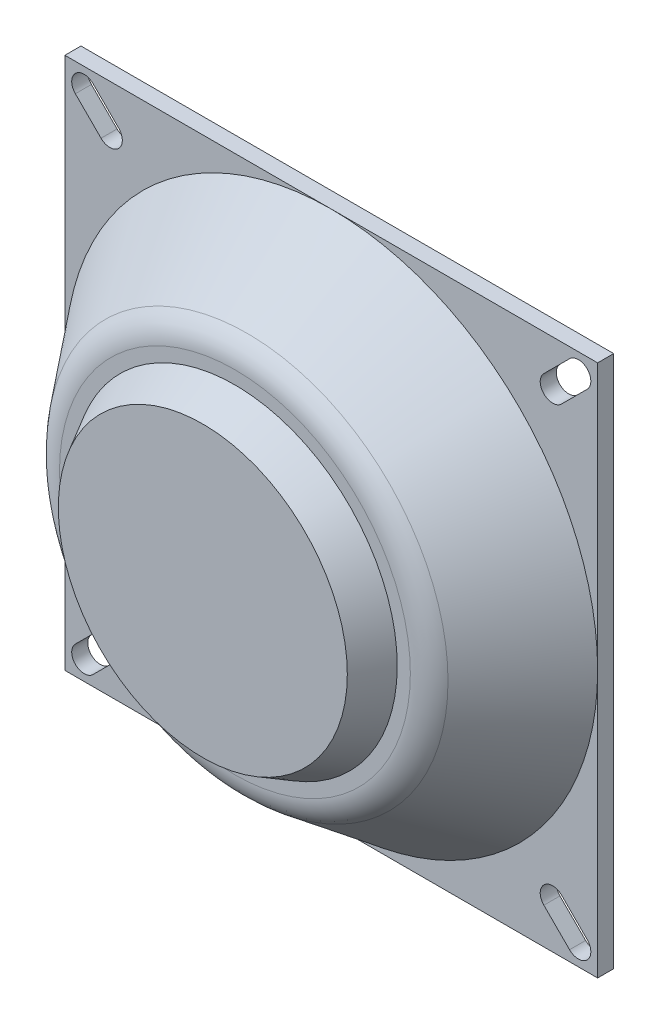
ISO-10303-21;
HEADER;
FILE_DESCRIPTION(('STEP AP214'),'2;1');
FILE_NAME('part.step','',(''),(''),'','','');
FILE_SCHEMA(('AUTOMOTIVE_DESIGN { 1 0 10303 214 1 1 1 1 }'));
ENDSEC;
DATA;
#1=APPLICATION_CONTEXT('core data for automotive mechanical design processes');
#2=APPLICATION_PROTOCOL_DEFINITION('international standard','automotive_design',2000,#1);
#3=PRODUCT_CONTEXT('',#1,'mechanical');
#4=PRODUCT('Part','Part','',(#3));
#5=PRODUCT_RELATED_PRODUCT_CATEGORY('part','',(#4));
#6=PRODUCT_DEFINITION_FORMATION('','',#4);
#7=PRODUCT_DEFINITION_CONTEXT('part definition',#1,'design');
#8=PRODUCT_DEFINITION('design','',#6,#7);
#9=PRODUCT_DEFINITION_SHAPE('','',#8);
#10=(LENGTH_UNIT() NAMED_UNIT(*) SI_UNIT(.MILLI.,.METRE.));
#11=(NAMED_UNIT(*) PLANE_ANGLE_UNIT() SI_UNIT($,.RADIAN.));
#12=(NAMED_UNIT(*) SI_UNIT($,.STERADIAN.) SOLID_ANGLE_UNIT());
#13=UNCERTAINTY_MEASURE_WITH_UNIT(LENGTH_MEASURE(1.E-05),#10,'distance_accuracy_value','');
#14=(GEOMETRIC_REPRESENTATION_CONTEXT(3) GLOBAL_UNCERTAINTY_ASSIGNED_CONTEXT((#13)) GLOBAL_UNIT_ASSIGNED_CONTEXT((#10,
#11,#12)) REPRESENTATION_CONTEXT('',''));
#15=CARTESIAN_POINT('',(0.,0.,0.));
#16=DIRECTION('',(0.,0.,1.));
#17=DIRECTION('',(1.,0.,0.));
#18=AXIS2_PLACEMENT_3D('',#15,#16,#17);
#19=CARTESIAN_POINT('',(-305.359774758607,116.794851209174,0.));
#20=DIRECTION('',(0.,0.,-1.));
#21=DIRECTION('',(1.,0.,0.));
#22=AXIS2_PLACEMENT_3D('',#19,#20,#21);
#23=CONICAL_SURFACE('',#22,45.,0.506145483078356);
#24=CARTESIAN_POINT('',(-305.359774758607,116.794851209174,-10.));
#25=DIRECTION('',(0.,0.,1.));
#26=DIRECTION('',(1.,0.,0.));
#27=AXIS2_PLACEMENT_3D('',#24,#25,#26);
#28=CIRCLE('',#27,50.5430905145277);
#29=CARTESIAN_POINT('',(-254.816684244079,116.794851209174,-10.));
#30=VERTEX_POINT('',#29);
#31=EDGE_CURVE('E441',#30,#30,#28,.F.);
#32=ORIENTED_EDGE('',*,*,#31,.F.);
#33=EDGE_LOOP('',(#32));
#34=FACE_BOUND('',#33,.T.);
#35=CARTESIAN_POINT('',(-305.359774758607,116.794851209174,0.));
#36=DIRECTION('',(0.,0.,1.));
#37=DIRECTION('',(1.,0.,0.));
#38=AXIS2_PLACEMENT_3D('',#35,#36,#37);
#39=CIRCLE('',#38,45.);
#40=CARTESIAN_POINT('',(-260.359774758607,116.794851209174,0.));
#41=VERTEX_POINT('',#40);
#42=EDGE_CURVE('E436',#41,#41,#39,.T.);
#43=ORIENTED_EDGE('',*,*,#42,.F.);
#44=EDGE_LOOP('',(#43));
#45=FACE_BOUND('',#44,.T.);
#46=ADVANCED_FACE('F45',(#34,#45),#23,.T.);
#47=CARTESIAN_POINT('',(0.,0.,0.));
#48=DIRECTION('',(0.,0.,1.));
#49=DIRECTION('',(1.,0.,0.));
#50=AXIS2_PLACEMENT_3D('',#47,#48,#49);
#51=PLANE('',#50);
#52=ORIENTED_EDGE('',*,*,#42,.T.);
#53=EDGE_LOOP('',(#52));
#54=FACE_BOUND('',#53,.T.);
#55=ADVANCED_FACE('F467',(#54),#51,.T.);
#56=CARTESIAN_POINT('',(-305.359774758607,116.794851209174,-10.));
#57=DIRECTION('',(0.,0.,-1.));
#58=DIRECTION('',(1.,0.,0.));
#59=AXIS2_PLACEMENT_3D('',#56,#57,#58);
#60=CONICAL_SURFACE('',#59,59.508676160867,0.663225115757846);
#61=CARTESIAN_POINT('',(-305.359774758607,116.794851209174,-13.8433852467434));
#62=DIRECTION('',(0.,0.,1.));
#63=DIRECTION('',(1.,0.,0.));
#64=AXIS2_PLACEMENT_3D('',#61,#62,#63);
#65=CIRCLE('',#64,62.5114578112756);
#66=CARTESIAN_POINT('',(-242.848316947331,116.794851209174,-13.8433852467434));
#67=VERTEX_POINT('',#66);
#68=EDGE_CURVE('E11',#67,#67,#65,.F.);
#69=ORIENTED_EDGE('',*,*,#68,.T.);
#70=EDGE_LOOP('',(#69));
#71=FACE_BOUND('',#70,.T.);
#72=CARTESIAN_POINT('',(-305.359774758607,116.794851209174,-40.));
#73=DIRECTION('',(0.,0.,1.));
#74=DIRECTION('',(1.,0.,0.));
#75=AXIS2_PLACEMENT_3D('',#72,#73,#74);
#76=CIRCLE('',#75,82.9472449560686);
#77=CARTESIAN_POINT('',(-222.412529802538,116.794851209174,-40.));
#78=VERTEX_POINT('',#77);
#79=CARTESIAN_POINT('',(-305.359774758607,33.8476062531058,-40.));
#80=VERTEX_POINT('',#79);
#81=EDGE_CURVE('E432',#78,#80,#76,.F.);
#82=ORIENTED_EDGE('',*,*,#81,.F.);
#83=CARTESIAN_POINT('',(-305.359774758607,199.742096165243,-40.));
#84=VERTEX_POINT('',#83);
#85=EDGE_CURVE('E61',#84,#78,#76,.F.);
#86=ORIENTED_EDGE('',*,*,#85,.F.);
#87=CARTESIAN_POINT('',(-388.307019714675,116.794851209174,-40.));
#88=VERTEX_POINT('',#87);
#89=EDGE_CURVE('E65',#88,#84,#76,.F.);
#90=ORIENTED_EDGE('',*,*,#89,.F.);
#91=EDGE_CURVE('E437',#80,#88,#76,.F.);
#92=ORIENTED_EDGE('',*,*,#91,.F.);
#93=EDGE_LOOP('',(#82,#86,#90,#92));
#94=FACE_BOUND('',#93,.T.);
#95=ADVANCED_FACE('F463',(#71,#94),#60,.T.);
#96=CARTESIAN_POINT('',(-305.359774758607,116.794851209174,-10.));
#97=DIRECTION('',(0.,0.,1.));
#98=DIRECTION('',(1.,0.,0.));
#99=AXIS2_PLACEMENT_3D('',#96,#97,#98);
#100=PLANE('',#99);
#101=CARTESIAN_POINT('',(-305.359774758607,116.794851209174,-10.));
#102=DIRECTION('',(0.,0.,1.));
#103=DIRECTION('',(1.,0.,0.));
#104=AXIS2_PLACEMENT_3D('',#101,#102,#103);
#105=CIRCLE('',#104,54.6313502752084);
#106=CARTESIAN_POINT('',(-250.728424483398,116.794851209174,-10.));
#107=VERTEX_POINT('',#106);
#108=EDGE_CURVE('E54',#107,#107,#105,.T.);
#109=ORIENTED_EDGE('',*,*,#108,.T.);
#110=EDGE_LOOP('',(#109));
#111=FACE_BOUND('',#110,.T.);
#112=ORIENTED_EDGE('',*,*,#31,.T.);
#113=EDGE_LOOP('',(#112));
#114=FACE_BOUND('',#113,.T.);
#115=ADVANCED_FACE('F448',(#111,#114),#100,.T.);
#116=CARTESIAN_POINT('',(-305.359774758607,116.794851209174,-20.));
#117=DIRECTION('',(0.,0.,1.));
#118=DIRECTION('',(1.,0.,0.));
#119=AXIS2_PLACEMENT_3D('',#116,#117,#118);
#120=TOROIDAL_SURFACE('',#119,54.6313502752084,10.);
#121=ORIENTED_EDGE('',*,*,#68,.F.);
#122=EDGE_LOOP('',(#121));
#123=FACE_BOUND('',#122,.T.);
#124=ORIENTED_EDGE('',*,*,#108,.F.);
#125=EDGE_LOOP('',(#124));
#126=FACE_BOUND('',#125,.T.);
#127=ADVANCED_FACE('F47',(#123,#126),#120,.T.);
#128=CARTESIAN_POINT('',(0.,0.,-40.));
#129=DIRECTION('',(0.,0.,-1.));
#130=DIRECTION('',(-1.,0.,0.));
#131=AXIS2_PLACEMENT_3D('',#128,#129,#130);
#132=PLANE('',#131);
#133=DIRECTION('',(-0.707106781186547,0.707106781186547,0.));
#134=VECTOR('',#133,1.);
#135=CARTESIAN_POINT('',(-225.670814757752,42.5893212978924,-40.));
#136=LINE('',#135,#134);
#137=CARTESIAN_POINT('',(-225.670814757752,42.5893212978924,-40.));
#138=VERTEX_POINT('',#137);
#139=CARTESIAN_POINT('',(-233.670814757752,50.5893212978924,-40.));
#140=VERTEX_POINT('',#139);
#141=EDGE_CURVE('E234',#138,#140,#136,.T.);
#142=ORIENTED_EDGE('',*,*,#141,.F.);
#143=CARTESIAN_POINT('',(-228.412529802538,39.8476062531059,-40.));
#144=DIRECTION('',(0.,0.,1.));
#145=DIRECTION('',(-1.,0.,0.));
#146=AXIS2_PLACEMENT_3D('',#143,#144,#145);
#147=CIRCLE('',#146,3.87737060049937);
#148=CARTESIAN_POINT('',(-231.154244847325,37.1058912083194,-40.));
#149=VERTEX_POINT('',#148);
#150=EDGE_CURVE('E200',#149,#138,#147,.T.);
#151=ORIENTED_EDGE('',*,*,#150,.F.);
#152=DIRECTION('',(0.707106781186547,-0.707106781186547,0.));
#153=VECTOR('',#152,1.);
#154=CARTESIAN_POINT('',(-231.154244847325,37.1058912083194,-40.));
#155=LINE('',#154,#153);
#156=CARTESIAN_POINT('',(-239.154244847325,45.1058912083195,-40.));
#157=VERTEX_POINT('',#156);
#158=EDGE_CURVE('E221',#157,#149,#155,.T.);
#159=ORIENTED_EDGE('',*,*,#158,.F.);
#160=CARTESIAN_POINT('',(-236.412529802538,47.8476062531059,-40.));
#161=DIRECTION('',(0.,0.,1.));
#162=DIRECTION('',(-1.,0.,0.));
#163=AXIS2_PLACEMENT_3D('',#160,#161,#162);
#164=CIRCLE('',#163,3.87737060049937);
#165=EDGE_CURVE('E225',#140,#157,#164,.T.);
#166=ORIENTED_EDGE('',*,*,#165,.F.);
#167=EDGE_LOOP('',(#142,#151,#159,#166));
#168=FACE_BOUND('',#167,.T.);
#169=DIRECTION('',(0.,1.,0.));
#170=VECTOR('',#169,1.);
#171=CARTESIAN_POINT('',(-222.412529802538,199.742096165243,-40.));
#172=LINE('',#171,#170);
#173=CARTESIAN_POINT('',(-222.412529802538,33.8476062531059,-40.));
#174=VERTEX_POINT('',#173);
#175=EDGE_CURVE('E409',#174,#78,#172,.T.);
#176=ORIENTED_EDGE('',*,*,#175,.T.);
#177=ORIENTED_EDGE('',*,*,#81,.T.);
#178=DIRECTION('',(1.,0.,0.));
#179=VECTOR('',#178,1.);
#180=CARTESIAN_POINT('',(-222.412529802538,33.8476062531059,-40.));
#181=LINE('',#180,#179);
#182=EDGE_CURVE('E403',#80,#174,#181,.T.);
#183=ORIENTED_EDGE('',*,*,#182,.T.);
#184=EDGE_LOOP('',(#176,#177,#183));
#185=FACE_BOUND('',#184,.T.);
#186=ADVANCED_FACE('F452',(#168,#185),#132,.F.);
#187=DIRECTION('',(0.707106781186549,0.707106781186546,0.));
#188=VECTOR('',#187,1.);
#189=CARTESIAN_POINT('',(-379.565304669889,37.1058912083194,-40.));
#190=LINE('',#189,#188);
#191=CARTESIAN_POINT('',(-379.565304669889,37.1058912083195,-40.));
#192=VERTEX_POINT('',#191);
#193=CARTESIAN_POINT('',(-371.565304669889,45.1058912083194,-40.));
#194=VERTEX_POINT('',#193);
#195=EDGE_CURVE('E269',#192,#194,#190,.T.);
#196=ORIENTED_EDGE('',*,*,#195,.F.);
#197=CARTESIAN_POINT('',(-382.307019714675,39.8476062531059,-40.));
#198=DIRECTION('',(0.,0.,1.));
#199=DIRECTION('',(1.,0.,0.));
#200=AXIS2_PLACEMENT_3D('',#197,#198,#199);
#201=CIRCLE('',#200,3.87737060049939);
#202=CARTESIAN_POINT('',(-385.048734759462,42.5893212978924,-40.));
#203=VERTEX_POINT('',#202);
#204=EDGE_CURVE('E243',#203,#192,#201,.T.);
#205=ORIENTED_EDGE('',*,*,#204,.F.);
#206=DIRECTION('',(-0.707106781186551,-0.707106781186544,0.));
#207=VECTOR('',#206,1.);
#208=CARTESIAN_POINT('',(-385.048734759462,42.5893212978924,-40.));
#209=LINE('',#208,#207);
#210=CARTESIAN_POINT('',(-377.048734759462,50.5893212978923,-40.));
#211=VERTEX_POINT('',#210);
#212=EDGE_CURVE('E254',#211,#203,#209,.T.);
#213=ORIENTED_EDGE('',*,*,#212,.F.);
#214=CARTESIAN_POINT('',(-374.307019714675,47.8476062531059,-40.));
#215=DIRECTION('',(0.,0.,1.));
#216=DIRECTION('',(1.,0.,0.));
#217=AXIS2_PLACEMENT_3D('',#214,#215,#216);
#218=CIRCLE('',#217,3.87737060049937);
#219=EDGE_CURVE('E273',#194,#211,#218,.T.);
#220=ORIENTED_EDGE('',*,*,#219,.F.);
#221=EDGE_LOOP('',(#196,#205,#213,#220));
#222=FACE_BOUND('',#221,.T.);
#223=CARTESIAN_POINT('',(-388.307019714675,33.8476062531058,-40.));
#224=VERTEX_POINT('',#223);
#225=EDGE_CURVE('E404',#224,#80,#181,.T.);
#226=ORIENTED_EDGE('',*,*,#225,.T.);
#227=ORIENTED_EDGE('',*,*,#91,.T.);
#228=DIRECTION('',(0.,-1.,0.));
#229=VECTOR('',#228,1.);
#230=CARTESIAN_POINT('',(-388.307019714675,199.742096165243,-40.));
#231=LINE('',#230,#229);
#232=EDGE_CURVE('E371',#88,#224,#231,.T.);
#233=ORIENTED_EDGE('',*,*,#232,.T.);
#234=EDGE_LOOP('',(#226,#227,#233));
#235=FACE_BOUND('',#234,.T.);
#236=ADVANCED_FACE('F459',(#222,#235),#132,.F.);
#237=DIRECTION('',(0.707106781186551,-0.707106781186544,0.));
#238=VECTOR('',#237,1.);
#239=CARTESIAN_POINT('',(-385.048734759462,191.000381120456,-40.));
#240=LINE('',#239,#238);
#241=CARTESIAN_POINT('',(-385.048734759462,191.000381120456,-40.));
#242=VERTEX_POINT('',#241);
#243=CARTESIAN_POINT('',(-377.048734759462,183.000381120456,-40.));
#244=VERTEX_POINT('',#243);
#245=EDGE_CURVE('E313',#242,#244,#240,.T.);
#246=ORIENTED_EDGE('',*,*,#245,.F.);
#247=CARTESIAN_POINT('',(-382.307019714675,193.742096165243,-40.));
#248=DIRECTION('',(0.,0.,1.));
#249=DIRECTION('',(-1.,0.,0.));
#250=AXIS2_PLACEMENT_3D('',#247,#248,#249);
#251=CIRCLE('',#250,3.87737060049939);
#252=CARTESIAN_POINT('',(-379.565304669889,196.483811210029,-40.));
#253=VERTEX_POINT('',#252);
#254=EDGE_CURVE('E283',#253,#242,#251,.T.);
#255=ORIENTED_EDGE('',*,*,#254,.F.);
#256=DIRECTION('',(-0.707106781186549,0.707106781186546,0.));
#257=VECTOR('',#256,1.);
#258=CARTESIAN_POINT('',(-379.565304669889,196.483811210029,-40.));
#259=LINE('',#258,#257);
#260=CARTESIAN_POINT('',(-371.565304669889,188.483811210029,-40.));
#261=VERTEX_POINT('',#260);
#262=EDGE_CURVE('E298',#261,#253,#259,.T.);
#263=ORIENTED_EDGE('',*,*,#262,.F.);
#264=CARTESIAN_POINT('',(-374.307019714675,185.742096165243,-40.));
#265=DIRECTION('',(0.,0.,1.));
#266=DIRECTION('',(-1.,0.,0.));
#267=AXIS2_PLACEMENT_3D('',#264,#265,#266);
#268=CIRCLE('',#267,3.87737060049937);
#269=EDGE_CURVE('E317',#244,#261,#268,.T.);
#270=ORIENTED_EDGE('',*,*,#269,.F.);
#271=EDGE_LOOP('',(#246,#255,#263,#270));
#272=FACE_BOUND('',#271,.T.);
#273=CARTESIAN_POINT('',(-388.307019714675,199.742096165243,-40.));
#274=VERTEX_POINT('',#273);
#275=EDGE_CURVE('E399',#274,#88,#231,.T.);
#276=ORIENTED_EDGE('',*,*,#275,.T.);
#277=ORIENTED_EDGE('',*,*,#89,.T.);
#278=DIRECTION('',(-1.,0.,0.));
#279=VECTOR('',#278,1.);
#280=CARTESIAN_POINT('',(-222.412529802538,199.742096165243,-40.));
#281=LINE('',#280,#279);
#282=EDGE_CURVE('E413',#84,#274,#281,.T.);
#283=ORIENTED_EDGE('',*,*,#282,.T.);
#284=EDGE_LOOP('',(#276,#277,#283));
#285=FACE_BOUND('',#284,.T.);
#286=ADVANCED_FACE('F584',(#272,#285),#132,.F.);
#287=DIRECTION('',(-0.707106781186547,-0.707106781186547,0.));
#288=VECTOR('',#287,1.);
#289=CARTESIAN_POINT('',(-231.154244847325,196.483811210029,-40.));
#290=LINE('',#289,#288);
#291=CARTESIAN_POINT('',(-231.154244847325,196.483811210029,-40.));
#292=VERTEX_POINT('',#291);
#293=CARTESIAN_POINT('',(-239.154244847325,188.483811210029,-40.));
#294=VERTEX_POINT('',#293);
#295=EDGE_CURVE('E357',#292,#294,#290,.T.);
#296=ORIENTED_EDGE('',*,*,#295,.F.);
#297=CARTESIAN_POINT('',(-228.412529802538,193.742096165243,-40.));
#298=DIRECTION('',(0.,0.,1.));
#299=DIRECTION('',(1.,0.,0.));
#300=AXIS2_PLACEMENT_3D('',#297,#298,#299);
#301=CIRCLE('',#300,3.87737060049937);
#302=CARTESIAN_POINT('',(-225.670814757752,191.000381120456,-40.));
#303=VERTEX_POINT('',#302);
#304=EDGE_CURVE('E327',#303,#292,#301,.T.);
#305=ORIENTED_EDGE('',*,*,#304,.F.);
#306=DIRECTION('',(0.707106781186547,0.707106781186547,0.));
#307=VECTOR('',#306,1.);
#308=CARTESIAN_POINT('',(-225.670814757752,191.000381120456,-40.));
#309=LINE('',#308,#307);
#310=CARTESIAN_POINT('',(-233.670814757752,183.000381120456,-40.));
#311=VERTEX_POINT('',#310);
#312=EDGE_CURVE('E342',#311,#303,#309,.T.);
#313=ORIENTED_EDGE('',*,*,#312,.F.);
#314=CARTESIAN_POINT('',(-236.412529802538,185.742096165243,-40.));
#315=DIRECTION('',(0.,0.,1.));
#316=DIRECTION('',(1.,0.,0.));
#317=AXIS2_PLACEMENT_3D('',#314,#315,#316);
#318=CIRCLE('',#317,3.87737060049937);
#319=EDGE_CURVE('E361',#294,#311,#318,.T.);
#320=ORIENTED_EDGE('',*,*,#319,.F.);
#321=EDGE_LOOP('',(#296,#305,#313,#320));
#322=FACE_BOUND('',#321,.T.);
#323=CARTESIAN_POINT('',(-222.412529802538,199.742096165243,-40.));
#324=VERTEX_POINT('',#323);
#325=EDGE_CURVE('E386',#324,#84,#281,.T.);
#326=ORIENTED_EDGE('',*,*,#325,.T.);
#327=ORIENTED_EDGE('',*,*,#85,.T.);
#328=EDGE_CURVE('E408',#78,#324,#172,.T.);
#329=ORIENTED_EDGE('',*,*,#328,.T.);
#330=EDGE_LOOP('',(#326,#327,#329));
#331=FACE_BOUND('',#330,.T.);
#332=ADVANCED_FACE('F462',(#322,#331),#132,.F.);
#333=CARTESIAN_POINT('',(-388.307019714675,199.742096165243,-45.));
#334=DIRECTION('',(-1.,0.,0.));
#335=DIRECTION('',(0.,-1.,0.));
#336=AXIS2_PLACEMENT_3D('',#333,#334,#335);
#337=PLANE('',#336);
#338=ORIENTED_EDGE('',*,*,#275,.F.);
#339=DIRECTION('',(0.,0.,1.));
#340=VECTOR('',#339,1.);
#341=CARTESIAN_POINT('',(-388.307019714675,199.742096165243,-45.));
#342=LINE('',#341,#340);
#343=CARTESIAN_POINT('',(-388.307019714675,199.742096165243,-45.));
#344=VERTEX_POINT('',#343);
#345=EDGE_CURVE('E417',#344,#274,#342,.T.);
#346=ORIENTED_EDGE('',*,*,#345,.F.);
#347=DIRECTION('',(0.,-1.,0.));
#348=VECTOR('',#347,1.);
#349=CARTESIAN_POINT('',(-388.307019714675,199.742096165243,-45.));
#350=LINE('',#349,#348);
#351=CARTESIAN_POINT('',(-388.307019714675,33.8476062531058,-45.));
#352=VERTEX_POINT('',#351);
#353=EDGE_CURVE('E381',#344,#352,#350,.T.);
#354=ORIENTED_EDGE('',*,*,#353,.T.);
#355=DIRECTION('',(0.,0.,1.));
#356=VECTOR('',#355,1.);
#357=CARTESIAN_POINT('',(-388.307019714675,33.8476062531058,-45.));
#358=LINE('',#357,#356);
#359=EDGE_CURVE('E398',#352,#224,#358,.T.);
#360=ORIENTED_EDGE('',*,*,#359,.T.);
#361=ORIENTED_EDGE('',*,*,#232,.F.);
#362=EDGE_LOOP('',(#338,#346,#354,#360,#361));
#363=FACE_BOUND('',#362,.T.);
#364=ADVANCED_FACE('F479',(#363),#337,.T.);
#365=CARTESIAN_POINT('',(-222.412529802538,199.742096165243,-45.));
#366=DIRECTION('',(0.,1.,0.));
#367=DIRECTION('',(-1.,0.,0.));
#368=AXIS2_PLACEMENT_3D('',#365,#366,#367);
#369=PLANE('',#368);
#370=ORIENTED_EDGE('',*,*,#325,.F.);
#371=DIRECTION('',(0.,0.,1.));
#372=VECTOR('',#371,1.);
#373=CARTESIAN_POINT('',(-222.412529802538,199.742096165243,-45.));
#374=LINE('',#373,#372);
#375=CARTESIAN_POINT('',(-222.412529802538,199.742096165243,-45.));
#376=VERTEX_POINT('',#375);
#377=EDGE_CURVE('E421',#376,#324,#374,.T.);
#378=ORIENTED_EDGE('',*,*,#377,.F.);
#379=DIRECTION('',(-1.,0.,0.));
#380=VECTOR('',#379,1.);
#381=CARTESIAN_POINT('',(-222.412529802538,199.742096165243,-45.));
#382=LINE('',#381,#380);
#383=EDGE_CURVE('E394',#376,#344,#382,.T.);
#384=ORIENTED_EDGE('',*,*,#383,.T.);
#385=ORIENTED_EDGE('',*,*,#345,.T.);
#386=ORIENTED_EDGE('',*,*,#282,.F.);
#387=EDGE_LOOP('',(#370,#378,#384,#385,#386));
#388=FACE_BOUND('',#387,.T.);
#389=ADVANCED_FACE('F482',(#388),#369,.T.);
#390=CARTESIAN_POINT('',(-222.412529802538,199.742096165243,-45.));
#391=DIRECTION('',(1.,0.,0.));
#392=DIRECTION('',(0.,1.,0.));
#393=AXIS2_PLACEMENT_3D('',#390,#391,#392);
#394=PLANE('',#393);
#395=ORIENTED_EDGE('',*,*,#175,.F.);
#396=DIRECTION('',(0.,0.,1.));
#397=VECTOR('',#396,1.);
#398=CARTESIAN_POINT('',(-222.412529802538,33.8476062531059,-45.));
#399=LINE('',#398,#397);
#400=CARTESIAN_POINT('',(-222.412529802538,33.8476062531059,-45.));
#401=VERTEX_POINT('',#400);
#402=EDGE_CURVE('E425',#401,#174,#399,.T.);
#403=ORIENTED_EDGE('',*,*,#402,.F.);
#404=DIRECTION('',(0.,1.,0.));
#405=VECTOR('',#404,1.);
#406=CARTESIAN_POINT('',(-222.412529802538,199.742096165243,-45.));
#407=LINE('',#406,#405);
#408=EDGE_CURVE('E390',#401,#376,#407,.T.);
#409=ORIENTED_EDGE('',*,*,#408,.T.);
#410=ORIENTED_EDGE('',*,*,#377,.T.);
#411=ORIENTED_EDGE('',*,*,#328,.F.);
#412=EDGE_LOOP('',(#395,#403,#409,#410,#411));
#413=FACE_BOUND('',#412,.T.);
#414=ADVANCED_FACE('F487',(#413),#394,.T.);
#415=CARTESIAN_POINT('',(-222.412529802538,33.8476062531059,-45.));
#416=DIRECTION('',(0.,-1.,0.));
#417=DIRECTION('',(1.,0.,0.));
#418=AXIS2_PLACEMENT_3D('',#415,#416,#417);
#419=PLANE('',#418);
#420=ORIENTED_EDGE('',*,*,#225,.F.);
#421=ORIENTED_EDGE('',*,*,#359,.F.);
#422=DIRECTION('',(1.,0.,0.));
#423=VECTOR('',#422,1.);
#424=CARTESIAN_POINT('',(-222.412529802538,33.8476062531059,-45.));
#425=LINE('',#424,#423);
#426=EDGE_CURVE('E385',#352,#401,#425,.T.);
#427=ORIENTED_EDGE('',*,*,#426,.T.);
#428=ORIENTED_EDGE('',*,*,#402,.T.);
#429=ORIENTED_EDGE('',*,*,#182,.F.);
#430=EDGE_LOOP('',(#420,#421,#427,#428,#429));
#431=FACE_BOUND('',#430,.T.);
#432=ADVANCED_FACE('F484',(#431),#419,.T.);
#433=CARTESIAN_POINT('',(0.,0.,-45.));
#434=DIRECTION('',(0.,0.,-1.));
#435=DIRECTION('',(-1.,0.,0.));
#436=AXIS2_PLACEMENT_3D('',#433,#434,#435);
#437=PLANE('',#436);
#438=CARTESIAN_POINT('',(-228.412529802538,39.8476062531059,-45.));
#439=DIRECTION('',(0.,0.,1.));
#440=DIRECTION('',(-1.,0.,0.));
#441=AXIS2_PLACEMENT_3D('',#438,#439,#440);
#442=CIRCLE('',#441,3.87737060049937);
#443=CARTESIAN_POINT('',(-231.154244847325,37.1058912083194,-45.));
#444=VERTEX_POINT('',#443);
#445=CARTESIAN_POINT('',(-225.670814757752,42.5893212978924,-45.));
#446=VERTEX_POINT('',#445);
#447=EDGE_CURVE('E197',#444,#446,#442,.T.);
#448=ORIENTED_EDGE('',*,*,#447,.T.);
#449=DIRECTION('',(-0.707106781186547,0.707106781186547,0.));
#450=VECTOR('',#449,1.);
#451=CARTESIAN_POINT('',(-225.670814757752,42.5893212978924,-45.));
#452=LINE('',#451,#450);
#453=CARTESIAN_POINT('',(-233.670814757752,50.5893212978924,-45.));
#454=VERTEX_POINT('',#453);
#455=EDGE_CURVE('E210',#446,#454,#452,.T.);
#456=ORIENTED_EDGE('',*,*,#455,.T.);
#457=CARTESIAN_POINT('',(-236.412529802538,47.8476062531059,-45.));
#458=DIRECTION('',(0.,0.,1.));
#459=DIRECTION('',(-1.,0.,0.));
#460=AXIS2_PLACEMENT_3D('',#457,#458,#459);
#461=CIRCLE('',#460,3.87737060049937);
#462=CARTESIAN_POINT('',(-239.154244847325,45.1058912083195,-45.));
#463=VERTEX_POINT('',#462);
#464=EDGE_CURVE('E215',#454,#463,#461,.T.);
#465=ORIENTED_EDGE('',*,*,#464,.T.);
#466=DIRECTION('',(0.707106781186547,-0.707106781186547,0.));
#467=VECTOR('',#466,1.);
#468=CARTESIAN_POINT('',(-231.154244847325,37.1058912083194,-45.));
#469=LINE('',#468,#467);
#470=EDGE_CURVE('E206',#463,#444,#469,.T.);
#471=ORIENTED_EDGE('',*,*,#470,.T.);
#472=EDGE_LOOP('',(#448,#456,#465,#471));
#473=FACE_BOUND('',#472,.T.);
#474=CARTESIAN_POINT('',(-382.307019714675,39.8476062531059,-45.));
#475=DIRECTION('',(0.,0.,1.));
#476=DIRECTION('',(1.,0.,0.));
#477=AXIS2_PLACEMENT_3D('',#474,#475,#476);
#478=CIRCLE('',#477,3.87737060049939);
#479=CARTESIAN_POINT('',(-385.048734759462,42.5893212978924,-45.));
#480=VERTEX_POINT('',#479);
#481=CARTESIAN_POINT('',(-379.565304669889,37.1058912083194,-45.));
#482=VERTEX_POINT('',#481);
#483=EDGE_CURVE('E249',#480,#482,#478,.T.);
#484=ORIENTED_EDGE('',*,*,#483,.T.);
#485=DIRECTION('',(0.707106781186549,0.707106781186546,0.));
#486=VECTOR('',#485,1.);
#487=CARTESIAN_POINT('',(-379.565304669889,37.1058912083194,-45.));
#488=LINE('',#487,#486);
#489=CARTESIAN_POINT('',(-371.565304669889,45.1058912083195,-45.));
#490=VERTEX_POINT('',#489);
#491=EDGE_CURVE('E253',#482,#490,#488,.T.);
#492=ORIENTED_EDGE('',*,*,#491,.T.);
#493=CARTESIAN_POINT('',(-374.307019714675,47.8476062531059,-45.));
#494=DIRECTION('',(0.,0.,1.));
#495=DIRECTION('',(1.,0.,0.));
#496=AXIS2_PLACEMENT_3D('',#493,#494,#495);
#497=CIRCLE('',#496,3.87737060049937);
#498=CARTESIAN_POINT('',(-377.048734759462,50.5893212978923,-45.));
#499=VERTEX_POINT('',#498);
#500=EDGE_CURVE('E258',#490,#499,#497,.T.);
#501=ORIENTED_EDGE('',*,*,#500,.T.);
#502=DIRECTION('',(-0.707106781186551,-0.707106781186544,0.));
#503=VECTOR('',#502,1.);
#504=CARTESIAN_POINT('',(-385.048734759462,42.5893212978924,-45.));
#505=LINE('',#504,#503);
#506=EDGE_CURVE('E262',#499,#480,#505,.T.);
#507=ORIENTED_EDGE('',*,*,#506,.T.);
#508=EDGE_LOOP('',(#484,#492,#501,#507));
#509=FACE_BOUND('',#508,.T.);
#510=CARTESIAN_POINT('',(-382.307019714675,193.742096165243,-45.));
#511=DIRECTION('',(0.,0.,1.));
#512=DIRECTION('',(-1.,0.,0.));
#513=AXIS2_PLACEMENT_3D('',#510,#511,#512);
#514=CIRCLE('',#513,3.87737060049939);
#515=CARTESIAN_POINT('',(-379.565304669889,196.483811210029,-45.));
#516=VERTEX_POINT('',#515);
#517=CARTESIAN_POINT('',(-385.048734759462,191.000381120456,-45.));
#518=VERTEX_POINT('',#517);
#519=EDGE_CURVE('E293',#516,#518,#514,.T.);
#520=ORIENTED_EDGE('',*,*,#519,.T.);
#521=DIRECTION('',(0.707106781186551,-0.707106781186544,0.));
#522=VECTOR('',#521,1.);
#523=CARTESIAN_POINT('',(-385.048734759462,191.000381120456,-45.));
#524=LINE('',#523,#522);
#525=CARTESIAN_POINT('',(-377.048734759462,183.000381120456,-45.));
#526=VERTEX_POINT('',#525);
#527=EDGE_CURVE('E297',#518,#526,#524,.T.);
#528=ORIENTED_EDGE('',*,*,#527,.T.);
#529=CARTESIAN_POINT('',(-374.307019714675,185.742096165243,-45.));
#530=DIRECTION('',(0.,0.,1.));
#531=DIRECTION('',(-1.,0.,0.));
#532=AXIS2_PLACEMENT_3D('',#529,#530,#531);
#533=CIRCLE('',#532,3.87737060049937);
#534=CARTESIAN_POINT('',(-371.565304669889,188.483811210029,-45.));
#535=VERTEX_POINT('',#534);
#536=EDGE_CURVE('E302',#526,#535,#533,.T.);
#537=ORIENTED_EDGE('',*,*,#536,.T.);
#538=DIRECTION('',(-0.707106781186549,0.707106781186546,0.));
#539=VECTOR('',#538,1.);
#540=CARTESIAN_POINT('',(-379.565304669889,196.483811210029,-45.));
#541=LINE('',#540,#539);
#542=EDGE_CURVE('E306',#535,#516,#541,.T.);
#543=ORIENTED_EDGE('',*,*,#542,.T.);
#544=EDGE_LOOP('',(#520,#528,#537,#543));
#545=FACE_BOUND('',#544,.T.);
#546=CARTESIAN_POINT('',(-228.412529802538,193.742096165243,-45.));
#547=DIRECTION('',(0.,0.,1.));
#548=DIRECTION('',(1.,0.,0.));
#549=AXIS2_PLACEMENT_3D('',#546,#547,#548);
#550=CIRCLE('',#549,3.87737060049937);
#551=CARTESIAN_POINT('',(-225.670814757752,191.000381120456,-45.));
#552=VERTEX_POINT('',#551);
#553=CARTESIAN_POINT('',(-231.154244847325,196.483811210029,-45.));
#554=VERTEX_POINT('',#553);
#555=EDGE_CURVE('E337',#552,#554,#550,.T.);
#556=ORIENTED_EDGE('',*,*,#555,.T.);
#557=DIRECTION('',(-0.707106781186547,-0.707106781186547,0.));
#558=VECTOR('',#557,1.);
#559=CARTESIAN_POINT('',(-231.154244847325,196.483811210029,-45.));
#560=LINE('',#559,#558);
#561=CARTESIAN_POINT('',(-239.154244847325,188.483811210029,-45.));
#562=VERTEX_POINT('',#561);
#563=EDGE_CURVE('E341',#554,#562,#560,.T.);
#564=ORIENTED_EDGE('',*,*,#563,.T.);
#565=CARTESIAN_POINT('',(-236.412529802538,185.742096165243,-45.));
#566=DIRECTION('',(0.,0.,1.));
#567=DIRECTION('',(1.,0.,0.));
#568=AXIS2_PLACEMENT_3D('',#565,#566,#567);
#569=CIRCLE('',#568,3.87737060049937);
#570=CARTESIAN_POINT('',(-233.670814757752,183.000381120456,-45.));
#571=VERTEX_POINT('',#570);
#572=EDGE_CURVE('E346',#562,#571,#569,.T.);
#573=ORIENTED_EDGE('',*,*,#572,.T.);
#574=DIRECTION('',(0.707106781186547,0.707106781186547,0.));
#575=VECTOR('',#574,1.);
#576=CARTESIAN_POINT('',(-225.670814757752,191.000381120456,-45.));
#577=LINE('',#576,#575);
#578=EDGE_CURVE('E350',#571,#552,#577,.T.);
#579=ORIENTED_EDGE('',*,*,#578,.T.);
#580=EDGE_LOOP('',(#556,#564,#573,#579));
#581=FACE_BOUND('',#580,.T.);
#582=ORIENTED_EDGE('',*,*,#353,.F.);
#583=ORIENTED_EDGE('',*,*,#383,.F.);
#584=ORIENTED_EDGE('',*,*,#408,.F.);
#585=ORIENTED_EDGE('',*,*,#426,.F.);
#586=EDGE_LOOP('',(#582,#583,#584,#585));
#587=FACE_BOUND('',#586,.T.);
#588=ADVANCED_FACE('F217',(#473,#509,#545,#581,#587),#437,.T.);
#589=CARTESIAN_POINT('',(-228.412529802538,193.742096165243,-45.));
#590=DIRECTION('',(0.,0.,1.));
#591=DIRECTION('',(1.,0.,0.));
#592=AXIS2_PLACEMENT_3D('',#589,#590,#591);
#593=CYLINDRICAL_SURFACE('',#592,3.87737060049937);
#594=ORIENTED_EDGE('',*,*,#304,.T.);
#595=DIRECTION('',(0.,0.,1.));
#596=VECTOR('',#595,1.);
#597=CARTESIAN_POINT('',(-231.154244847325,196.483811210029,-45.));
#598=LINE('',#597,#596);
#599=EDGE_CURVE('E354',#554,#292,#598,.T.);
#600=ORIENTED_EDGE('',*,*,#599,.F.);
#601=ORIENTED_EDGE('',*,*,#555,.F.);
#602=DIRECTION('',(0.,0.,1.));
#603=VECTOR('',#602,1.);
#604=CARTESIAN_POINT('',(-225.670814757752,191.000381120456,-45.));
#605=LINE('',#604,#603);
#606=EDGE_CURVE('E368',#552,#303,#605,.T.);
#607=ORIENTED_EDGE('',*,*,#606,.T.);
#608=EDGE_LOOP('',(#594,#600,#601,#607));
#609=FACE_BOUND('',#608,.T.);
#610=ADVANCED_FACE('F497',(#609),#593,.F.);
#611=CARTESIAN_POINT('',(-225.670814757752,191.000381120456,-45.));
#612=DIRECTION('',(0.707106781186548,-0.707106781186548,0.));
#613=DIRECTION('',(0.707106781186548,0.707106781186548,0.));
#614=AXIS2_PLACEMENT_3D('',#611,#612,#613);
#615=PLANE('',#614);
#616=ORIENTED_EDGE('',*,*,#312,.T.);
#617=ORIENTED_EDGE('',*,*,#606,.F.);
#618=ORIENTED_EDGE('',*,*,#578,.F.);
#619=DIRECTION('',(0.,0.,1.));
#620=VECTOR('',#619,1.);
#621=CARTESIAN_POINT('',(-233.670814757752,183.000381120456,-45.));
#622=LINE('',#621,#620);
#623=EDGE_CURVE('E372',#571,#311,#622,.T.);
#624=ORIENTED_EDGE('',*,*,#623,.T.);
#625=EDGE_LOOP('',(#616,#617,#618,#624));
#626=FACE_BOUND('',#625,.T.);
#627=ADVANCED_FACE('F500',(#626),#615,.F.);
#628=CARTESIAN_POINT('',(-236.412529802538,185.742096165243,-45.));
#629=DIRECTION('',(0.,0.,1.));
#630=DIRECTION('',(1.,0.,0.));
#631=AXIS2_PLACEMENT_3D('',#628,#629,#630);
#632=CYLINDRICAL_SURFACE('',#631,3.87737060049937);
#633=ORIENTED_EDGE('',*,*,#319,.T.);
#634=ORIENTED_EDGE('',*,*,#623,.F.);
#635=ORIENTED_EDGE('',*,*,#572,.F.);
#636=DIRECTION('',(0.,0.,1.));
#637=VECTOR('',#636,1.);
#638=CARTESIAN_POINT('',(-239.154244847325,188.483811210029,-45.));
#639=LINE('',#638,#637);
#640=EDGE_CURVE('E375',#562,#294,#639,.T.);
#641=ORIENTED_EDGE('',*,*,#640,.T.);
#642=EDGE_LOOP('',(#633,#634,#635,#641));
#643=FACE_BOUND('',#642,.T.);
#644=ADVANCED_FACE('F506',(#643),#632,.F.);
#645=CARTESIAN_POINT('',(-231.154244847325,196.483811210029,-45.));
#646=DIRECTION('',(-0.707106781186548,0.707106781186548,0.));
#647=DIRECTION('',(-0.707106781186548,-0.707106781186548,0.));
#648=AXIS2_PLACEMENT_3D('',#645,#646,#647);
#649=PLANE('',#648);
#650=ORIENTED_EDGE('',*,*,#295,.T.);
#651=ORIENTED_EDGE('',*,*,#640,.F.);
#652=ORIENTED_EDGE('',*,*,#563,.F.);
#653=ORIENTED_EDGE('',*,*,#599,.T.);
#654=EDGE_LOOP('',(#650,#651,#652,#653));
#655=FACE_BOUND('',#654,.T.);
#656=ADVANCED_FACE('F502',(#655),#649,.F.);
#657=CARTESIAN_POINT('',(-382.307019714675,193.742096165243,-45.));
#658=DIRECTION('',(0.,0.,1.));
#659=DIRECTION('',(1.,0.,0.));
#660=AXIS2_PLACEMENT_3D('',#657,#658,#659);
#661=CYLINDRICAL_SURFACE('',#660,3.87737060049939);
#662=ORIENTED_EDGE('',*,*,#254,.T.);
#663=DIRECTION('',(0.,0.,1.));
#664=VECTOR('',#663,1.);
#665=CARTESIAN_POINT('',(-385.048734759462,191.000381120456,-45.));
#666=LINE('',#665,#664);
#667=EDGE_CURVE('E310',#518,#242,#666,.T.);
#668=ORIENTED_EDGE('',*,*,#667,.F.);
#669=ORIENTED_EDGE('',*,*,#519,.F.);
#670=DIRECTION('',(0.,0.,1.));
#671=VECTOR('',#670,1.);
#672=CARTESIAN_POINT('',(-379.565304669889,196.483811210029,-45.));
#673=LINE('',#672,#671);
#674=EDGE_CURVE('E324',#516,#253,#673,.T.);
#675=ORIENTED_EDGE('',*,*,#674,.T.);
#676=EDGE_LOOP('',(#662,#668,#669,#675));
#677=FACE_BOUND('',#676,.T.);
#678=ADVANCED_FACE('F505',(#677),#661,.F.);
#679=CARTESIAN_POINT('',(-379.565304669889,196.483811210029,-45.));
#680=DIRECTION('',(0.707106781186546,0.707106781186549,0.));
#681=DIRECTION('',(-0.707106781186549,0.707106781186546,0.));
#682=AXIS2_PLACEMENT_3D('',#679,#680,#681);
#683=PLANE('',#682);
#684=ORIENTED_EDGE('',*,*,#262,.T.);
#685=ORIENTED_EDGE('',*,*,#674,.F.);
#686=ORIENTED_EDGE('',*,*,#542,.F.);
#687=DIRECTION('',(0.,0.,1.));
#688=VECTOR('',#687,1.);
#689=CARTESIAN_POINT('',(-371.565304669889,188.483811210029,-45.));
#690=LINE('',#689,#688);
#691=EDGE_CURVE('E328',#535,#261,#690,.T.);
#692=ORIENTED_EDGE('',*,*,#691,.T.);
#693=EDGE_LOOP('',(#684,#685,#686,#692));
#694=FACE_BOUND('',#693,.T.);
#695=ADVANCED_FACE('F516',(#694),#683,.F.);
#696=CARTESIAN_POINT('',(-374.307019714675,185.742096165243,-45.));
#697=DIRECTION('',(0.,0.,1.));
#698=DIRECTION('',(1.,0.,0.));
#699=AXIS2_PLACEMENT_3D('',#696,#697,#698);
#700=CYLINDRICAL_SURFACE('',#699,3.87737060049937);
#701=ORIENTED_EDGE('',*,*,#269,.T.);
#702=ORIENTED_EDGE('',*,*,#691,.F.);
#703=ORIENTED_EDGE('',*,*,#536,.F.);
#704=DIRECTION('',(0.,0.,1.));
#705=VECTOR('',#704,1.);
#706=CARTESIAN_POINT('',(-377.048734759462,183.000381120456,-45.));
#707=LINE('',#706,#705);
#708=EDGE_CURVE('E331',#526,#244,#707,.T.);
#709=ORIENTED_EDGE('',*,*,#708,.T.);
#710=EDGE_LOOP('',(#701,#702,#703,#709));
#711=FACE_BOUND('',#710,.T.);
#712=ADVANCED_FACE('F522',(#711),#700,.F.);
#713=CARTESIAN_POINT('',(-385.048734759462,191.000381120456,-45.));
#714=DIRECTION('',(-0.707106781186544,-0.707106781186551,0.));
#715=DIRECTION('',(0.707106781186551,-0.707106781186544,0.));
#716=AXIS2_PLACEMENT_3D('',#713,#714,#715);
#717=PLANE('',#716);
#718=ORIENTED_EDGE('',*,*,#245,.T.);
#719=ORIENTED_EDGE('',*,*,#708,.F.);
#720=ORIENTED_EDGE('',*,*,#527,.F.);
#721=ORIENTED_EDGE('',*,*,#667,.T.);
#722=EDGE_LOOP('',(#718,#719,#720,#721));
#723=FACE_BOUND('',#722,.T.);
#724=ADVANCED_FACE('F518',(#723),#717,.F.);
#725=CARTESIAN_POINT('',(-382.307019714675,39.8476062531059,-45.));
#726=DIRECTION('',(0.,0.,1.));
#727=DIRECTION('',(1.,0.,0.));
#728=AXIS2_PLACEMENT_3D('',#725,#726,#727);
#729=CYLINDRICAL_SURFACE('',#728,3.87737060049939);
#730=ORIENTED_EDGE('',*,*,#204,.T.);
#731=DIRECTION('',(0.,0.,1.));
#732=VECTOR('',#731,1.);
#733=CARTESIAN_POINT('',(-379.565304669889,37.1058912083194,-45.));
#734=LINE('',#733,#732);
#735=EDGE_CURVE('E266',#482,#192,#734,.T.);
#736=ORIENTED_EDGE('',*,*,#735,.F.);
#737=ORIENTED_EDGE('',*,*,#483,.F.);
#738=DIRECTION('',(0.,0.,1.));
#739=VECTOR('',#738,1.);
#740=CARTESIAN_POINT('',(-385.048734759462,42.5893212978924,-45.));
#741=LINE('',#740,#739);
#742=EDGE_CURVE('E280',#480,#203,#741,.T.);
#743=ORIENTED_EDGE('',*,*,#742,.T.);
#744=EDGE_LOOP('',(#730,#736,#737,#743));
#745=FACE_BOUND('',#744,.T.);
#746=ADVANCED_FACE('F521',(#745),#729,.F.);
#747=CARTESIAN_POINT('',(-385.048734759462,42.5893212978924,-45.));
#748=DIRECTION('',(-0.707106781186544,0.707106781186551,0.));
#749=DIRECTION('',(-0.707106781186551,-0.707106781186544,0.));
#750=AXIS2_PLACEMENT_3D('',#747,#748,#749);
#751=PLANE('',#750);
#752=ORIENTED_EDGE('',*,*,#212,.T.);
#753=ORIENTED_EDGE('',*,*,#742,.F.);
#754=ORIENTED_EDGE('',*,*,#506,.F.);
#755=DIRECTION('',(0.,0.,1.));
#756=VECTOR('',#755,1.);
#757=CARTESIAN_POINT('',(-377.048734759462,50.5893212978923,-45.));
#758=LINE('',#757,#756);
#759=EDGE_CURVE('E284',#499,#211,#758,.T.);
#760=ORIENTED_EDGE('',*,*,#759,.T.);
#761=EDGE_LOOP('',(#752,#753,#754,#760));
#762=FACE_BOUND('',#761,.T.);
#763=ADVANCED_FACE('F532',(#762),#751,.F.);
#764=CARTESIAN_POINT('',(-374.307019714675,47.8476062531059,-45.));
#765=DIRECTION('',(0.,0.,1.));
#766=DIRECTION('',(1.,0.,0.));
#767=AXIS2_PLACEMENT_3D('',#764,#765,#766);
#768=CYLINDRICAL_SURFACE('',#767,3.87737060049937);
#769=ORIENTED_EDGE('',*,*,#219,.T.);
#770=ORIENTED_EDGE('',*,*,#759,.F.);
#771=ORIENTED_EDGE('',*,*,#500,.F.);
#772=DIRECTION('',(0.,0.,1.));
#773=VECTOR('',#772,1.);
#774=CARTESIAN_POINT('',(-371.565304669889,45.1058912083194,-45.));
#775=LINE('',#774,#773);
#776=EDGE_CURVE('E287',#490,#194,#775,.T.);
#777=ORIENTED_EDGE('',*,*,#776,.T.);
#778=EDGE_LOOP('',(#769,#770,#771,#777));
#779=FACE_BOUND('',#778,.T.);
#780=ADVANCED_FACE('F537',(#779),#768,.F.);
#781=CARTESIAN_POINT('',(-379.565304669889,37.1058912083194,-45.));
#782=DIRECTION('',(0.707106781186546,-0.707106781186549,0.));
#783=DIRECTION('',(0.707106781186549,0.707106781186546,0.));
#784=AXIS2_PLACEMENT_3D('',#781,#782,#783);
#785=PLANE('',#784);
#786=ORIENTED_EDGE('',*,*,#195,.T.);
#787=ORIENTED_EDGE('',*,*,#776,.F.);
#788=ORIENTED_EDGE('',*,*,#491,.F.);
#789=ORIENTED_EDGE('',*,*,#735,.T.);
#790=EDGE_LOOP('',(#786,#787,#788,#789));
#791=FACE_BOUND('',#790,.T.);
#792=ADVANCED_FACE('F534',(#791),#785,.F.);
#793=CARTESIAN_POINT('',(-228.412529802538,39.8476062531059,-45.));
#794=DIRECTION('',(0.,0.,1.));
#795=DIRECTION('',(1.,0.,0.));
#796=AXIS2_PLACEMENT_3D('',#793,#794,#795);
#797=CYLINDRICAL_SURFACE('',#796,3.87737060049937);
#798=ORIENTED_EDGE('',*,*,#150,.T.);
#799=DIRECTION('',(0.,0.,1.));
#800=VECTOR('',#799,1.);
#801=CARTESIAN_POINT('',(-225.670814757752,42.5893212978924,-45.));
#802=LINE('',#801,#800);
#803=EDGE_CURVE('E193',#446,#138,#802,.T.);
#804=ORIENTED_EDGE('',*,*,#803,.F.);
#805=ORIENTED_EDGE('',*,*,#447,.F.);
#806=DIRECTION('',(0.,0.,1.));
#807=VECTOR('',#806,1.);
#808=CARTESIAN_POINT('',(-231.154244847325,37.1058912083194,-45.));
#809=LINE('',#808,#807);
#810=EDGE_CURVE('E240',#444,#149,#809,.T.);
#811=ORIENTED_EDGE('',*,*,#810,.T.);
#812=EDGE_LOOP('',(#798,#804,#805,#811));
#813=FACE_BOUND('',#812,.T.);
#814=ADVANCED_FACE('F195',(#813),#797,.F.);
#815=CARTESIAN_POINT('',(-231.154244847325,37.1058912083194,-45.));
#816=DIRECTION('',(-0.707106781186548,-0.707106781186548,0.));
#817=DIRECTION('',(0.707106781186548,-0.707106781186548,0.));
#818=AXIS2_PLACEMENT_3D('',#815,#816,#817);
#819=PLANE('',#818);
#820=ORIENTED_EDGE('',*,*,#158,.T.);
#821=ORIENTED_EDGE('',*,*,#810,.F.);
#822=ORIENTED_EDGE('',*,*,#470,.F.);
#823=DIRECTION('',(0.,0.,1.));
#824=VECTOR('',#823,1.);
#825=CARTESIAN_POINT('',(-239.154244847325,45.1058912083195,-45.));
#826=LINE('',#825,#824);
#827=EDGE_CURVE('E244',#463,#157,#826,.T.);
#828=ORIENTED_EDGE('',*,*,#827,.T.);
#829=EDGE_LOOP('',(#820,#821,#822,#828));
#830=FACE_BOUND('',#829,.T.);
#831=ADVANCED_FACE('F547',(#830),#819,.F.);
#832=CARTESIAN_POINT('',(-236.412529802538,47.8476062531059,-45.));
#833=DIRECTION('',(0.,0.,1.));
#834=DIRECTION('',(1.,0.,0.));
#835=AXIS2_PLACEMENT_3D('',#832,#833,#834);
#836=CYLINDRICAL_SURFACE('',#835,3.87737060049937);
#837=ORIENTED_EDGE('',*,*,#165,.T.);
#838=ORIENTED_EDGE('',*,*,#827,.F.);
#839=ORIENTED_EDGE('',*,*,#464,.F.);
#840=DIRECTION('',(0.,0.,1.));
#841=VECTOR('',#840,1.);
#842=CARTESIAN_POINT('',(-233.670814757752,50.5893212978924,-45.));
#843=LINE('',#842,#841);
#844=EDGE_CURVE('E205',#454,#140,#843,.T.);
#845=ORIENTED_EDGE('',*,*,#844,.T.);
#846=EDGE_LOOP('',(#837,#838,#839,#845));
#847=FACE_BOUND('',#846,.T.);
#848=ADVANCED_FACE('F550',(#847),#836,.F.);
#849=CARTESIAN_POINT('',(-225.670814757752,42.5893212978924,-45.));
#850=DIRECTION('',(0.707106781186548,0.707106781186548,0.));
#851=DIRECTION('',(-0.707106781186548,0.707106781186548,0.));
#852=AXIS2_PLACEMENT_3D('',#849,#850,#851);
#853=PLANE('',#852);
#854=ORIENTED_EDGE('',*,*,#141,.T.);
#855=ORIENTED_EDGE('',*,*,#844,.F.);
#856=ORIENTED_EDGE('',*,*,#455,.F.);
#857=ORIENTED_EDGE('',*,*,#803,.T.);
#858=EDGE_LOOP('',(#854,#855,#856,#857));
#859=FACE_BOUND('',#858,.T.);
#860=ADVANCED_FACE('F211',(#859),#853,.F.);
#861=CLOSED_SHELL('',(#46,#55,#95,#115,#127,#186,#236,#286,#332,#364,#389,#414,#432,#588,#610,
#627,#644,#656,#678,#695,#712,#724,#746,#763,#780,#792,#814,#831,#848,#860));
#862=MANIFOLD_SOLID_BREP('B2',#861);
#863=ADVANCED_BREP_SHAPE_REPRESENTATION('',(#18,#862),#14);
#864=SHAPE_DEFINITION_REPRESENTATION(#9,#863);
ENDSEC;
END-ISO-10303-21;
